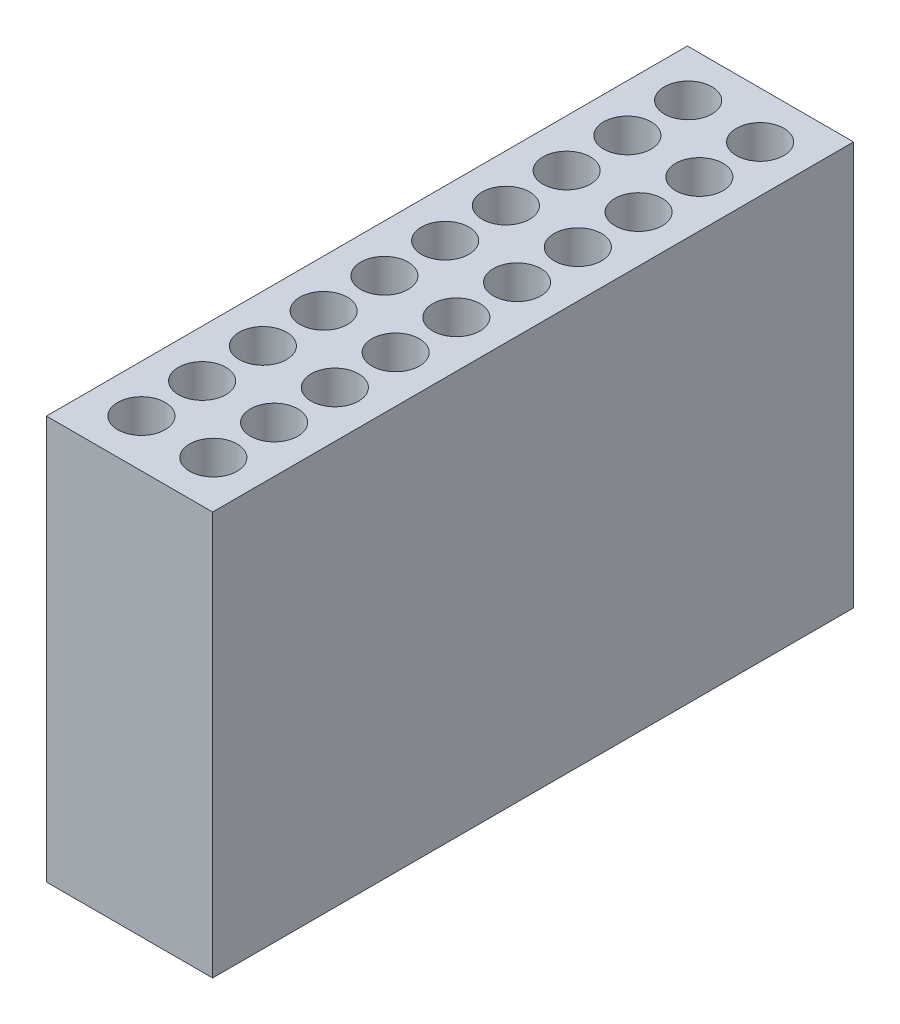
ISO-10303-21;
HEADER;
FILE_DESCRIPTION(('STEP AP214'),'2;1');
FILE_NAME('part.step','',(''),(''),'','','');
FILE_SCHEMA(('AUTOMOTIVE_DESIGN { 1 0 10303 214 1 1 1 1 }'));
ENDSEC;
DATA;
#1=APPLICATION_CONTEXT('core data for automotive mechanical design processes');
#2=APPLICATION_PROTOCOL_DEFINITION('international standard','automotive_design',2000,#1);
#3=PRODUCT_CONTEXT('',#1,'mechanical');
#4=PRODUCT('Part','Part','',(#3));
#5=PRODUCT_RELATED_PRODUCT_CATEGORY('part','',(#4));
#6=PRODUCT_DEFINITION_FORMATION('','',#4);
#7=PRODUCT_DEFINITION_CONTEXT('part definition',#1,'design');
#8=PRODUCT_DEFINITION('design','',#6,#7);
#9=PRODUCT_DEFINITION_SHAPE('','',#8);
#10=(LENGTH_UNIT() NAMED_UNIT(*) SI_UNIT(.MILLI.,.METRE.));
#11=(NAMED_UNIT(*) PLANE_ANGLE_UNIT() SI_UNIT($,.RADIAN.));
#12=(NAMED_UNIT(*) SI_UNIT($,.STERADIAN.) SOLID_ANGLE_UNIT());
#13=UNCERTAINTY_MEASURE_WITH_UNIT(LENGTH_MEASURE(1.E-05),#10,'distance_accuracy_value','');
#14=(GEOMETRIC_REPRESENTATION_CONTEXT(3) GLOBAL_UNCERTAINTY_ASSIGNED_CONTEXT((#13)) GLOBAL_UNIT_ASSIGNED_CONTEXT((#10,
#11,#12)) REPRESENTATION_CONTEXT('',''));
#15=CARTESIAN_POINT('',(0.,0.,0.));
#16=DIRECTION('',(0.,0.,1.));
#17=DIRECTION('',(1.,0.,0.));
#18=AXIS2_PLACEMENT_3D('',#15,#16,#17);
#19=CARTESIAN_POINT('',(0.389,0.,-2.929));
#20=DIRECTION('',(0.,1.,0.));
#21=DIRECTION('',(0.,0.,1.));
#22=AXIS2_PLACEMENT_3D('',#19,#20,#21);
#23=CYLINDRICAL_SURFACE('',#22,0.254);
#24=CARTESIAN_POINT('',(0.389,0.,-2.929));
#25=DIRECTION('',(0.,1.,0.));
#26=DIRECTION('',(0.,0.,1.));
#27=AXIS2_PLACEMENT_3D('',#24,#25,#26);
#28=CIRCLE('',#27,0.254);
#29=CARTESIAN_POINT('',(0.389,0.,-2.675));
#30=VERTEX_POINT('',#29);
#31=EDGE_CURVE('E42',#30,#30,#28,.T.);
#32=ORIENTED_EDGE('',*,*,#31,.F.);
#33=EDGE_LOOP('',(#32));
#34=FACE_BOUND('',#33,.T.);
#35=CARTESIAN_POINT('',(0.389,4.318,-2.929));
#36=DIRECTION('',(0.,1.,0.));
#37=DIRECTION('',(0.,0.,1.));
#38=AXIS2_PLACEMENT_3D('',#35,#36,#37);
#39=CIRCLE('',#38,0.254);
#40=CARTESIAN_POINT('',(0.389,4.318,-2.675));
#41=VERTEX_POINT('',#40);
#42=EDGE_CURVE('E11',#41,#41,#39,.T.);
#43=ORIENTED_EDGE('',*,*,#42,.T.);
#44=EDGE_LOOP('',(#43));
#45=FACE_BOUND('',#44,.T.);
#46=ADVANCED_FACE('F34',(#34,#45),#23,.F.);
#47=CARTESIAN_POINT('',(0.389,0.,-2.279));
#48=DIRECTION('',(0.,1.,0.));
#49=DIRECTION('',(0.,0.,1.));
#50=AXIS2_PLACEMENT_3D('',#47,#48,#49);
#51=CYLINDRICAL_SURFACE('',#50,0.254);
#52=CARTESIAN_POINT('',(0.389,0.,-2.279));
#53=DIRECTION('',(0.,1.,0.));
#54=DIRECTION('',(0.,0.,1.));
#55=AXIS2_PLACEMENT_3D('',#52,#53,#54);
#56=CIRCLE('',#55,0.254);
#57=CARTESIAN_POINT('',(0.389,0.,-2.025));
#58=VERTEX_POINT('',#57);
#59=EDGE_CURVE('E208',#58,#58,#56,.T.);
#60=ORIENTED_EDGE('',*,*,#59,.F.);
#61=EDGE_LOOP('',(#60));
#62=FACE_BOUND('',#61,.T.);
#63=CARTESIAN_POINT('',(0.389,4.318,-2.279));
#64=DIRECTION('',(0.,1.,0.));
#65=DIRECTION('',(0.,0.,1.));
#66=AXIS2_PLACEMENT_3D('',#63,#64,#65);
#67=CIRCLE('',#66,0.254);
#68=CARTESIAN_POINT('',(0.389,4.318,-2.025));
#69=VERTEX_POINT('',#68);
#70=EDGE_CURVE('E211',#69,#69,#67,.T.);
#71=ORIENTED_EDGE('',*,*,#70,.T.);
#72=EDGE_LOOP('',(#71));
#73=FACE_BOUND('',#72,.T.);
#74=ADVANCED_FACE('F220',(#62,#73),#51,.F.);
#75=CARTESIAN_POINT('',(0.389,0.,-1.629));
#76=DIRECTION('',(0.,1.,0.));
#77=DIRECTION('',(0.,0.,1.));
#78=AXIS2_PLACEMENT_3D('',#75,#76,#77);
#79=CYLINDRICAL_SURFACE('',#78,0.254);
#80=CARTESIAN_POINT('',(0.389,0.,-1.629));
#81=DIRECTION('',(0.,1.,0.));
#82=DIRECTION('',(0.,0.,1.));
#83=AXIS2_PLACEMENT_3D('',#80,#81,#82);
#84=CIRCLE('',#83,0.254);
#85=CARTESIAN_POINT('',(0.389,0.,-1.375));
#86=VERTEX_POINT('',#85);
#87=EDGE_CURVE('E202',#86,#86,#84,.T.);
#88=ORIENTED_EDGE('',*,*,#87,.F.);
#89=EDGE_LOOP('',(#88));
#90=FACE_BOUND('',#89,.T.);
#91=CARTESIAN_POINT('',(0.389,4.318,-1.629));
#92=DIRECTION('',(0.,1.,0.));
#93=DIRECTION('',(0.,0.,1.));
#94=AXIS2_PLACEMENT_3D('',#91,#92,#93);
#95=CIRCLE('',#94,0.254);
#96=CARTESIAN_POINT('',(0.389,4.318,-1.375));
#97=VERTEX_POINT('',#96);
#98=EDGE_CURVE('E205',#97,#97,#95,.T.);
#99=ORIENTED_EDGE('',*,*,#98,.T.);
#100=EDGE_LOOP('',(#99));
#101=FACE_BOUND('',#100,.T.);
#102=ADVANCED_FACE('F307',(#90,#101),#79,.F.);
#103=CARTESIAN_POINT('',(0.389,0.,-0.979));
#104=DIRECTION('',(0.,1.,0.));
#105=DIRECTION('',(0.,0.,1.));
#106=AXIS2_PLACEMENT_3D('',#103,#104,#105);
#107=CYLINDRICAL_SURFACE('',#106,0.254);
#108=CARTESIAN_POINT('',(0.389,0.,-0.979));
#109=DIRECTION('',(0.,1.,0.));
#110=DIRECTION('',(0.,0.,1.));
#111=AXIS2_PLACEMENT_3D('',#108,#109,#110);
#112=CIRCLE('',#111,0.254);
#113=CARTESIAN_POINT('',(0.389,0.,-0.725));
#114=VERTEX_POINT('',#113);
#115=EDGE_CURVE('E196',#114,#114,#112,.T.);
#116=ORIENTED_EDGE('',*,*,#115,.F.);
#117=EDGE_LOOP('',(#116));
#118=FACE_BOUND('',#117,.T.);
#119=CARTESIAN_POINT('',(0.389,4.318,-0.979));
#120=DIRECTION('',(0.,1.,0.));
#121=DIRECTION('',(0.,0.,1.));
#122=AXIS2_PLACEMENT_3D('',#119,#120,#121);
#123=CIRCLE('',#122,0.254);
#124=CARTESIAN_POINT('',(0.389,4.318,-0.725));
#125=VERTEX_POINT('',#124);
#126=EDGE_CURVE('E199',#125,#125,#123,.T.);
#127=ORIENTED_EDGE('',*,*,#126,.T.);
#128=EDGE_LOOP('',(#127));
#129=FACE_BOUND('',#128,.T.);
#130=ADVANCED_FACE('F303',(#118,#129),#107,.F.);
#131=CARTESIAN_POINT('',(0.389,0.,-0.329));
#132=DIRECTION('',(0.,1.,0.));
#133=DIRECTION('',(0.,0.,1.));
#134=AXIS2_PLACEMENT_3D('',#131,#132,#133);
#135=CYLINDRICAL_SURFACE('',#134,0.254);
#136=CARTESIAN_POINT('',(0.389,0.,-0.329));
#137=DIRECTION('',(0.,1.,0.));
#138=DIRECTION('',(0.,0.,1.));
#139=AXIS2_PLACEMENT_3D('',#136,#137,#138);
#140=CIRCLE('',#139,0.254);
#141=CARTESIAN_POINT('',(0.389,0.,-0.0749999999999999));
#142=VERTEX_POINT('',#141);
#143=EDGE_CURVE('E190',#142,#142,#140,.T.);
#144=ORIENTED_EDGE('',*,*,#143,.F.);
#145=EDGE_LOOP('',(#144));
#146=FACE_BOUND('',#145,.T.);
#147=CARTESIAN_POINT('',(0.389,4.318,-0.329));
#148=DIRECTION('',(0.,1.,0.));
#149=DIRECTION('',(0.,0.,1.));
#150=AXIS2_PLACEMENT_3D('',#147,#148,#149);
#151=CIRCLE('',#150,0.254);
#152=CARTESIAN_POINT('',(0.389,4.318,-0.0749999999999999));
#153=VERTEX_POINT('',#152);
#154=EDGE_CURVE('E193',#153,#153,#151,.T.);
#155=ORIENTED_EDGE('',*,*,#154,.T.);
#156=EDGE_LOOP('',(#155));
#157=FACE_BOUND('',#156,.T.);
#158=ADVANCED_FACE('F299',(#146,#157),#135,.F.);
#159=CARTESIAN_POINT('',(0.389,0.,0.321));
#160=DIRECTION('',(0.,1.,0.));
#161=DIRECTION('',(0.,0.,1.));
#162=AXIS2_PLACEMENT_3D('',#159,#160,#161);
#163=CYLINDRICAL_SURFACE('',#162,0.254);
#164=CARTESIAN_POINT('',(0.389,0.,0.321));
#165=DIRECTION('',(0.,1.,0.));
#166=DIRECTION('',(0.,0.,1.));
#167=AXIS2_PLACEMENT_3D('',#164,#165,#166);
#168=CIRCLE('',#167,0.254);
#169=CARTESIAN_POINT('',(0.389,0.,0.575));
#170=VERTEX_POINT('',#169);
#171=EDGE_CURVE('E184',#170,#170,#168,.T.);
#172=ORIENTED_EDGE('',*,*,#171,.F.);
#173=EDGE_LOOP('',(#172));
#174=FACE_BOUND('',#173,.T.);
#175=CARTESIAN_POINT('',(0.389,4.318,0.321));
#176=DIRECTION('',(0.,1.,0.));
#177=DIRECTION('',(0.,0.,1.));
#178=AXIS2_PLACEMENT_3D('',#175,#176,#177);
#179=CIRCLE('',#178,0.254);
#180=CARTESIAN_POINT('',(0.389,4.318,0.575));
#181=VERTEX_POINT('',#180);
#182=EDGE_CURVE('E187',#181,#181,#179,.T.);
#183=ORIENTED_EDGE('',*,*,#182,.T.);
#184=EDGE_LOOP('',(#183));
#185=FACE_BOUND('',#184,.T.);
#186=ADVANCED_FACE('F295',(#174,#185),#163,.F.);
#187=CARTESIAN_POINT('',(0.389,0.,0.971));
#188=DIRECTION('',(0.,1.,0.));
#189=DIRECTION('',(0.,0.,1.));
#190=AXIS2_PLACEMENT_3D('',#187,#188,#189);
#191=CYLINDRICAL_SURFACE('',#190,0.254);
#192=CARTESIAN_POINT('',(0.389,0.,0.971));
#193=DIRECTION('',(0.,1.,0.));
#194=DIRECTION('',(0.,0.,1.));
#195=AXIS2_PLACEMENT_3D('',#192,#193,#194);
#196=CIRCLE('',#195,0.254);
#197=CARTESIAN_POINT('',(0.389,0.,1.225));
#198=VERTEX_POINT('',#197);
#199=EDGE_CURVE('E178',#198,#198,#196,.T.);
#200=ORIENTED_EDGE('',*,*,#199,.F.);
#201=EDGE_LOOP('',(#200));
#202=FACE_BOUND('',#201,.T.);
#203=CARTESIAN_POINT('',(0.389,4.318,0.971));
#204=DIRECTION('',(0.,1.,0.));
#205=DIRECTION('',(0.,0.,1.));
#206=AXIS2_PLACEMENT_3D('',#203,#204,#205);
#207=CIRCLE('',#206,0.254);
#208=CARTESIAN_POINT('',(0.389,4.318,1.225));
#209=VERTEX_POINT('',#208);
#210=EDGE_CURVE('E181',#209,#209,#207,.T.);
#211=ORIENTED_EDGE('',*,*,#210,.T.);
#212=EDGE_LOOP('',(#211));
#213=FACE_BOUND('',#212,.T.);
#214=ADVANCED_FACE('F291',(#202,#213),#191,.F.);
#215=CARTESIAN_POINT('',(0.389,0.,1.621));
#216=DIRECTION('',(0.,1.,0.));
#217=DIRECTION('',(0.,0.,1.));
#218=AXIS2_PLACEMENT_3D('',#215,#216,#217);
#219=CYLINDRICAL_SURFACE('',#218,0.254);
#220=CARTESIAN_POINT('',(0.389,0.,1.621));
#221=DIRECTION('',(0.,1.,0.));
#222=DIRECTION('',(0.,0.,1.));
#223=AXIS2_PLACEMENT_3D('',#220,#221,#222);
#224=CIRCLE('',#223,0.254);
#225=CARTESIAN_POINT('',(0.389,0.,1.875));
#226=VERTEX_POINT('',#225);
#227=EDGE_CURVE('E172',#226,#226,#224,.T.);
#228=ORIENTED_EDGE('',*,*,#227,.F.);
#229=EDGE_LOOP('',(#228));
#230=FACE_BOUND('',#229,.T.);
#231=CARTESIAN_POINT('',(0.389,4.318,1.621));
#232=DIRECTION('',(0.,1.,0.));
#233=DIRECTION('',(0.,0.,1.));
#234=AXIS2_PLACEMENT_3D('',#231,#232,#233);
#235=CIRCLE('',#234,0.254);
#236=CARTESIAN_POINT('',(0.389,4.318,1.875));
#237=VERTEX_POINT('',#236);
#238=EDGE_CURVE('E175',#237,#237,#235,.T.);
#239=ORIENTED_EDGE('',*,*,#238,.T.);
#240=EDGE_LOOP('',(#239));
#241=FACE_BOUND('',#240,.T.);
#242=ADVANCED_FACE('F287',(#230,#241),#219,.F.);
#243=CARTESIAN_POINT('',(0.389,0.,2.271));
#244=DIRECTION('',(0.,1.,0.));
#245=DIRECTION('',(0.,0.,1.));
#246=AXIS2_PLACEMENT_3D('',#243,#244,#245);
#247=CYLINDRICAL_SURFACE('',#246,0.254);
#248=CARTESIAN_POINT('',(0.389,0.,2.271));
#249=DIRECTION('',(0.,1.,0.));
#250=DIRECTION('',(0.,0.,1.));
#251=AXIS2_PLACEMENT_3D('',#248,#249,#250);
#252=CIRCLE('',#251,0.254);
#253=CARTESIAN_POINT('',(0.389,0.,2.525));
#254=VERTEX_POINT('',#253);
#255=EDGE_CURVE('E166',#254,#254,#252,.T.);
#256=ORIENTED_EDGE('',*,*,#255,.F.);
#257=EDGE_LOOP('',(#256));
#258=FACE_BOUND('',#257,.T.);
#259=CARTESIAN_POINT('',(0.389,4.318,2.271));
#260=DIRECTION('',(0.,1.,0.));
#261=DIRECTION('',(0.,0.,1.));
#262=AXIS2_PLACEMENT_3D('',#259,#260,#261);
#263=CIRCLE('',#262,0.254);
#264=CARTESIAN_POINT('',(0.389,4.318,2.525));
#265=VERTEX_POINT('',#264);
#266=EDGE_CURVE('E169',#265,#265,#263,.T.);
#267=ORIENTED_EDGE('',*,*,#266,.T.);
#268=EDGE_LOOP('',(#267));
#269=FACE_BOUND('',#268,.T.);
#270=ADVANCED_FACE('F283',(#258,#269),#247,.F.);
#271=CARTESIAN_POINT('',(0.389,0.,2.921));
#272=DIRECTION('',(0.,1.,0.));
#273=DIRECTION('',(0.,0.,1.));
#274=AXIS2_PLACEMENT_3D('',#271,#272,#273);
#275=CYLINDRICAL_SURFACE('',#274,0.254);
#276=CARTESIAN_POINT('',(0.389,0.,2.921));
#277=DIRECTION('',(0.,1.,0.));
#278=DIRECTION('',(0.,0.,1.));
#279=AXIS2_PLACEMENT_3D('',#276,#277,#278);
#280=CIRCLE('',#279,0.254);
#281=CARTESIAN_POINT('',(0.389,0.,3.175));
#282=VERTEX_POINT('',#281);
#283=EDGE_CURVE('E160',#282,#282,#280,.T.);
#284=ORIENTED_EDGE('',*,*,#283,.F.);
#285=EDGE_LOOP('',(#284));
#286=FACE_BOUND('',#285,.T.);
#287=CARTESIAN_POINT('',(0.389,4.318,2.921));
#288=DIRECTION('',(0.,1.,0.));
#289=DIRECTION('',(0.,0.,1.));
#290=AXIS2_PLACEMENT_3D('',#287,#288,#289);
#291=CIRCLE('',#290,0.254);
#292=CARTESIAN_POINT('',(0.389,4.318,3.175));
#293=VERTEX_POINT('',#292);
#294=EDGE_CURVE('E163',#293,#293,#291,.T.);
#295=ORIENTED_EDGE('',*,*,#294,.T.);
#296=EDGE_LOOP('',(#295));
#297=FACE_BOUND('',#296,.T.);
#298=ADVANCED_FACE('F279',(#286,#297),#275,.F.);
#299=CARTESIAN_POINT('',(-0.381,0.,-2.929));
#300=DIRECTION('',(0.,1.,0.));
#301=DIRECTION('',(0.,0.,1.));
#302=AXIS2_PLACEMENT_3D('',#299,#300,#301);
#303=CYLINDRICAL_SURFACE('',#302,0.254);
#304=CARTESIAN_POINT('',(-0.381,0.,-2.929));
#305=DIRECTION('',(0.,1.,0.));
#306=DIRECTION('',(0.,0.,1.));
#307=AXIS2_PLACEMENT_3D('',#304,#305,#306);
#308=CIRCLE('',#307,0.254);
#309=CARTESIAN_POINT('',(-0.381,0.,-2.675));
#310=VERTEX_POINT('',#309);
#311=EDGE_CURVE('E154',#310,#310,#308,.T.);
#312=ORIENTED_EDGE('',*,*,#311,.F.);
#313=EDGE_LOOP('',(#312));
#314=FACE_BOUND('',#313,.T.);
#315=CARTESIAN_POINT('',(-0.381,4.318,-2.929));
#316=DIRECTION('',(0.,1.,0.));
#317=DIRECTION('',(0.,0.,1.));
#318=AXIS2_PLACEMENT_3D('',#315,#316,#317);
#319=CIRCLE('',#318,0.254);
#320=CARTESIAN_POINT('',(-0.381,4.318,-2.675));
#321=VERTEX_POINT('',#320);
#322=EDGE_CURVE('E157',#321,#321,#319,.T.);
#323=ORIENTED_EDGE('',*,*,#322,.T.);
#324=EDGE_LOOP('',(#323));
#325=FACE_BOUND('',#324,.T.);
#326=ADVANCED_FACE('F275',(#314,#325),#303,.F.);
#327=CARTESIAN_POINT('',(-0.381,0.,-2.279));
#328=DIRECTION('',(0.,1.,0.));
#329=DIRECTION('',(0.,0.,1.));
#330=AXIS2_PLACEMENT_3D('',#327,#328,#329);
#331=CYLINDRICAL_SURFACE('',#330,0.254);
#332=CARTESIAN_POINT('',(-0.381,0.,-2.279));
#333=DIRECTION('',(0.,1.,0.));
#334=DIRECTION('',(0.,0.,1.));
#335=AXIS2_PLACEMENT_3D('',#332,#333,#334);
#336=CIRCLE('',#335,0.254);
#337=CARTESIAN_POINT('',(-0.381,0.,-2.025));
#338=VERTEX_POINT('',#337);
#339=EDGE_CURVE('E148',#338,#338,#336,.T.);
#340=ORIENTED_EDGE('',*,*,#339,.F.);
#341=EDGE_LOOP('',(#340));
#342=FACE_BOUND('',#341,.T.);
#343=CARTESIAN_POINT('',(-0.381,4.318,-2.279));
#344=DIRECTION('',(0.,1.,0.));
#345=DIRECTION('',(0.,0.,1.));
#346=AXIS2_PLACEMENT_3D('',#343,#344,#345);
#347=CIRCLE('',#346,0.254);
#348=CARTESIAN_POINT('',(-0.381,4.318,-2.025));
#349=VERTEX_POINT('',#348);
#350=EDGE_CURVE('E151',#349,#349,#347,.T.);
#351=ORIENTED_EDGE('',*,*,#350,.T.);
#352=EDGE_LOOP('',(#351));
#353=FACE_BOUND('',#352,.T.);
#354=ADVANCED_FACE('F271',(#342,#353),#331,.F.);
#355=CARTESIAN_POINT('',(-0.381,0.,-1.629));
#356=DIRECTION('',(0.,1.,0.));
#357=DIRECTION('',(0.,0.,1.));
#358=AXIS2_PLACEMENT_3D('',#355,#356,#357);
#359=CYLINDRICAL_SURFACE('',#358,0.254);
#360=CARTESIAN_POINT('',(-0.381,0.,-1.629));
#361=DIRECTION('',(0.,1.,0.));
#362=DIRECTION('',(0.,0.,1.));
#363=AXIS2_PLACEMENT_3D('',#360,#361,#362);
#364=CIRCLE('',#363,0.254);
#365=CARTESIAN_POINT('',(-0.381,0.,-1.375));
#366=VERTEX_POINT('',#365);
#367=EDGE_CURVE('E142',#366,#366,#364,.T.);
#368=ORIENTED_EDGE('',*,*,#367,.F.);
#369=EDGE_LOOP('',(#368));
#370=FACE_BOUND('',#369,.T.);
#371=CARTESIAN_POINT('',(-0.381,4.318,-1.629));
#372=DIRECTION('',(0.,1.,0.));
#373=DIRECTION('',(0.,0.,1.));
#374=AXIS2_PLACEMENT_3D('',#371,#372,#373);
#375=CIRCLE('',#374,0.254);
#376=CARTESIAN_POINT('',(-0.381,4.318,-1.375));
#377=VERTEX_POINT('',#376);
#378=EDGE_CURVE('E145',#377,#377,#375,.T.);
#379=ORIENTED_EDGE('',*,*,#378,.T.);
#380=EDGE_LOOP('',(#379));
#381=FACE_BOUND('',#380,.T.);
#382=ADVANCED_FACE('F267',(#370,#381),#359,.F.);
#383=CARTESIAN_POINT('',(-0.381,0.,-0.979));
#384=DIRECTION('',(0.,1.,0.));
#385=DIRECTION('',(0.,0.,1.));
#386=AXIS2_PLACEMENT_3D('',#383,#384,#385);
#387=CYLINDRICAL_SURFACE('',#386,0.254);
#388=CARTESIAN_POINT('',(-0.381,0.,-0.979));
#389=DIRECTION('',(0.,1.,0.));
#390=DIRECTION('',(0.,0.,1.));
#391=AXIS2_PLACEMENT_3D('',#388,#389,#390);
#392=CIRCLE('',#391,0.254);
#393=CARTESIAN_POINT('',(-0.381,0.,-0.725));
#394=VERTEX_POINT('',#393);
#395=EDGE_CURVE('E136',#394,#394,#392,.T.);
#396=ORIENTED_EDGE('',*,*,#395,.F.);
#397=EDGE_LOOP('',(#396));
#398=FACE_BOUND('',#397,.T.);
#399=CARTESIAN_POINT('',(-0.381,4.318,-0.979));
#400=DIRECTION('',(0.,1.,0.));
#401=DIRECTION('',(0.,0.,1.));
#402=AXIS2_PLACEMENT_3D('',#399,#400,#401);
#403=CIRCLE('',#402,0.254);
#404=CARTESIAN_POINT('',(-0.381,4.318,-0.725));
#405=VERTEX_POINT('',#404);
#406=EDGE_CURVE('E139',#405,#405,#403,.T.);
#407=ORIENTED_EDGE('',*,*,#406,.T.);
#408=EDGE_LOOP('',(#407));
#409=FACE_BOUND('',#408,.T.);
#410=ADVANCED_FACE('F263',(#398,#409),#387,.F.);
#411=CARTESIAN_POINT('',(-0.381,0.,-0.329));
#412=DIRECTION('',(0.,1.,0.));
#413=DIRECTION('',(0.,0.,1.));
#414=AXIS2_PLACEMENT_3D('',#411,#412,#413);
#415=CYLINDRICAL_SURFACE('',#414,0.254);
#416=CARTESIAN_POINT('',(-0.381,0.,-0.329));
#417=DIRECTION('',(0.,1.,0.));
#418=DIRECTION('',(0.,0.,1.));
#419=AXIS2_PLACEMENT_3D('',#416,#417,#418);
#420=CIRCLE('',#419,0.254);
#421=CARTESIAN_POINT('',(-0.381,0.,-0.0749999999999999));
#422=VERTEX_POINT('',#421);
#423=EDGE_CURVE('E130',#422,#422,#420,.T.);
#424=ORIENTED_EDGE('',*,*,#423,.F.);
#425=EDGE_LOOP('',(#424));
#426=FACE_BOUND('',#425,.T.);
#427=CARTESIAN_POINT('',(-0.381,4.318,-0.329));
#428=DIRECTION('',(0.,1.,0.));
#429=DIRECTION('',(0.,0.,1.));
#430=AXIS2_PLACEMENT_3D('',#427,#428,#429);
#431=CIRCLE('',#430,0.254);
#432=CARTESIAN_POINT('',(-0.381,4.318,-0.0749999999999999));
#433=VERTEX_POINT('',#432);
#434=EDGE_CURVE('E133',#433,#433,#431,.T.);
#435=ORIENTED_EDGE('',*,*,#434,.T.);
#436=EDGE_LOOP('',(#435));
#437=FACE_BOUND('',#436,.T.);
#438=ADVANCED_FACE('F259',(#426,#437),#415,.F.);
#439=CARTESIAN_POINT('',(-0.381,0.,0.321));
#440=DIRECTION('',(0.,1.,0.));
#441=DIRECTION('',(0.,0.,1.));
#442=AXIS2_PLACEMENT_3D('',#439,#440,#441);
#443=CYLINDRICAL_SURFACE('',#442,0.254);
#444=CARTESIAN_POINT('',(-0.381,0.,0.321));
#445=DIRECTION('',(0.,1.,0.));
#446=DIRECTION('',(0.,0.,1.));
#447=AXIS2_PLACEMENT_3D('',#444,#445,#446);
#448=CIRCLE('',#447,0.254);
#449=CARTESIAN_POINT('',(-0.381,0.,0.575));
#450=VERTEX_POINT('',#449);
#451=EDGE_CURVE('E124',#450,#450,#448,.T.);
#452=ORIENTED_EDGE('',*,*,#451,.F.);
#453=EDGE_LOOP('',(#452));
#454=FACE_BOUND('',#453,.T.);
#455=CARTESIAN_POINT('',(-0.381,4.318,0.321));
#456=DIRECTION('',(0.,1.,0.));
#457=DIRECTION('',(0.,0.,1.));
#458=AXIS2_PLACEMENT_3D('',#455,#456,#457);
#459=CIRCLE('',#458,0.254);
#460=CARTESIAN_POINT('',(-0.381,4.318,0.575));
#461=VERTEX_POINT('',#460);
#462=EDGE_CURVE('E127',#461,#461,#459,.T.);
#463=ORIENTED_EDGE('',*,*,#462,.T.);
#464=EDGE_LOOP('',(#463));
#465=FACE_BOUND('',#464,.T.);
#466=ADVANCED_FACE('F255',(#454,#465),#443,.F.);
#467=CARTESIAN_POINT('',(-0.381,0.,0.971));
#468=DIRECTION('',(0.,1.,0.));
#469=DIRECTION('',(0.,0.,1.));
#470=AXIS2_PLACEMENT_3D('',#467,#468,#469);
#471=CYLINDRICAL_SURFACE('',#470,0.254);
#472=CARTESIAN_POINT('',(-0.381,0.,0.971));
#473=DIRECTION('',(0.,1.,0.));
#474=DIRECTION('',(0.,0.,1.));
#475=AXIS2_PLACEMENT_3D('',#472,#473,#474);
#476=CIRCLE('',#475,0.254);
#477=CARTESIAN_POINT('',(-0.381,0.,1.225));
#478=VERTEX_POINT('',#477);
#479=EDGE_CURVE('E118',#478,#478,#476,.T.);
#480=ORIENTED_EDGE('',*,*,#479,.F.);
#481=EDGE_LOOP('',(#480));
#482=FACE_BOUND('',#481,.T.);
#483=CARTESIAN_POINT('',(-0.381,4.318,0.971));
#484=DIRECTION('',(0.,1.,0.));
#485=DIRECTION('',(0.,0.,1.));
#486=AXIS2_PLACEMENT_3D('',#483,#484,#485);
#487=CIRCLE('',#486,0.254);
#488=CARTESIAN_POINT('',(-0.381,4.318,1.225));
#489=VERTEX_POINT('',#488);
#490=EDGE_CURVE('E121',#489,#489,#487,.T.);
#491=ORIENTED_EDGE('',*,*,#490,.T.);
#492=EDGE_LOOP('',(#491));
#493=FACE_BOUND('',#492,.T.);
#494=ADVANCED_FACE('F251',(#482,#493),#471,.F.);
#495=CARTESIAN_POINT('',(-0.381,0.,1.621));
#496=DIRECTION('',(0.,1.,0.));
#497=DIRECTION('',(0.,0.,1.));
#498=AXIS2_PLACEMENT_3D('',#495,#496,#497);
#499=CYLINDRICAL_SURFACE('',#498,0.254);
#500=CARTESIAN_POINT('',(-0.381,0.,1.621));
#501=DIRECTION('',(0.,1.,0.));
#502=DIRECTION('',(0.,0.,1.));
#503=AXIS2_PLACEMENT_3D('',#500,#501,#502);
#504=CIRCLE('',#503,0.254);
#505=CARTESIAN_POINT('',(-0.381,0.,1.875));
#506=VERTEX_POINT('',#505);
#507=EDGE_CURVE('E112',#506,#506,#504,.T.);
#508=ORIENTED_EDGE('',*,*,#507,.F.);
#509=EDGE_LOOP('',(#508));
#510=FACE_BOUND('',#509,.T.);
#511=CARTESIAN_POINT('',(-0.381,4.318,1.621));
#512=DIRECTION('',(0.,1.,0.));
#513=DIRECTION('',(0.,0.,1.));
#514=AXIS2_PLACEMENT_3D('',#511,#512,#513);
#515=CIRCLE('',#514,0.254);
#516=CARTESIAN_POINT('',(-0.381,4.318,1.875));
#517=VERTEX_POINT('',#516);
#518=EDGE_CURVE('E115',#517,#517,#515,.T.);
#519=ORIENTED_EDGE('',*,*,#518,.T.);
#520=EDGE_LOOP('',(#519));
#521=FACE_BOUND('',#520,.T.);
#522=ADVANCED_FACE('F247',(#510,#521),#499,.F.);
#523=CARTESIAN_POINT('',(0.889,4.318,3.429));
#524=DIRECTION('',(-1.,0.,0.));
#525=DIRECTION('',(0.,0.,1.));
#526=AXIS2_PLACEMENT_3D('',#523,#524,#525);
#527=PLANE('',#526);
#528=DIRECTION('',(0.,0.,-1.));
#529=VECTOR('',#528,1.);
#530=CARTESIAN_POINT('',(0.889,0.,3.429));
#531=LINE('',#530,#529);
#532=CARTESIAN_POINT('',(0.889,0.,3.429));
#533=VERTEX_POINT('',#532);
#534=CARTESIAN_POINT('',(0.889,0.,-3.429));
#535=VERTEX_POINT('',#534);
#536=EDGE_CURVE('E102',#533,#535,#531,.T.);
#537=ORIENTED_EDGE('',*,*,#536,.T.);
#538=DIRECTION('',(0.,-1.,0.));
#539=VECTOR('',#538,1.);
#540=CARTESIAN_POINT('',(0.889,4.318,-3.429));
#541=LINE('',#540,#539);
#542=CARTESIAN_POINT('',(0.889,4.318,-3.429));
#543=VERTEX_POINT('',#542);
#544=EDGE_CURVE('E93',#543,#535,#541,.T.);
#545=ORIENTED_EDGE('',*,*,#544,.F.);
#546=DIRECTION('',(0.,0.,-1.));
#547=VECTOR('',#546,1.);
#548=CARTESIAN_POINT('',(0.889,4.318,3.429));
#549=LINE('',#548,#547);
#550=CARTESIAN_POINT('',(0.889,4.318,3.429));
#551=VERTEX_POINT('',#550);
#552=EDGE_CURVE('E87',#551,#543,#549,.T.);
#553=ORIENTED_EDGE('',*,*,#552,.F.);
#554=DIRECTION('',(0.,-1.,0.));
#555=VECTOR('',#554,1.);
#556=CARTESIAN_POINT('',(0.889,4.318,3.429));
#557=LINE('',#556,#555);
#558=EDGE_CURVE('E98',#551,#533,#557,.T.);
#559=ORIENTED_EDGE('',*,*,#558,.T.);
#560=EDGE_LOOP('',(#537,#545,#553,#559));
#561=FACE_BOUND('',#560,.T.);
#562=ADVANCED_FACE('F244',(#561),#527,.F.);
#563=CARTESIAN_POINT('',(-0.889,4.318,-3.429));
#564=DIRECTION('',(0.,0.,1.));
#565=DIRECTION('',(1.,0.,0.));
#566=AXIS2_PLACEMENT_3D('',#563,#564,#565);
#567=PLANE('',#566);
#568=DIRECTION('',(-1.,0.,0.));
#569=VECTOR('',#568,1.);
#570=CARTESIAN_POINT('',(-0.889,0.,-3.429));
#571=LINE('',#570,#569);
#572=CARTESIAN_POINT('',(-0.889,0.,-3.429));
#573=VERTEX_POINT('',#572);
#574=EDGE_CURVE('E92',#535,#573,#571,.T.);
#575=ORIENTED_EDGE('',*,*,#574,.T.);
#576=DIRECTION('',(0.,-1.,0.));
#577=VECTOR('',#576,1.);
#578=CARTESIAN_POINT('',(-0.889,4.318,-3.429));
#579=LINE('',#578,#577);
#580=CARTESIAN_POINT('',(-0.889,4.318,-3.429));
#581=VERTEX_POINT('',#580);
#582=EDGE_CURVE('E90',#581,#573,#579,.T.);
#583=ORIENTED_EDGE('',*,*,#582,.F.);
#584=DIRECTION('',(-1.,0.,0.));
#585=VECTOR('',#584,1.);
#586=CARTESIAN_POINT('',(-0.889,4.318,-3.429));
#587=LINE('',#586,#585);
#588=EDGE_CURVE('E81',#543,#581,#587,.T.);
#589=ORIENTED_EDGE('',*,*,#588,.F.);
#590=ORIENTED_EDGE('',*,*,#544,.T.);
#591=EDGE_LOOP('',(#575,#583,#589,#590));
#592=FACE_BOUND('',#591,.T.);
#593=ADVANCED_FACE('F91',(#592),#567,.F.);
#594=CARTESIAN_POINT('',(-0.889,4.318,3.429));
#595=DIRECTION('',(1.,0.,0.));
#596=DIRECTION('',(0.,0.,-1.));
#597=AXIS2_PLACEMENT_3D('',#594,#595,#596);
#598=PLANE('',#597);
#599=DIRECTION('',(0.,0.,1.));
#600=VECTOR('',#599,1.);
#601=CARTESIAN_POINT('',(-0.889,0.,3.429));
#602=LINE('',#601,#600);
#603=CARTESIAN_POINT('',(-0.889,0.,3.429));
#604=VERTEX_POINT('',#603);
#605=EDGE_CURVE('E67',#573,#604,#602,.T.);
#606=ORIENTED_EDGE('',*,*,#605,.T.);
#607=DIRECTION('',(0.,-1.,0.));
#608=VECTOR('',#607,1.);
#609=CARTESIAN_POINT('',(-0.889,4.318,3.429));
#610=LINE('',#609,#608);
#611=CARTESIAN_POINT('',(-0.889,4.318,3.429));
#612=VERTEX_POINT('',#611);
#613=EDGE_CURVE('E94',#612,#604,#610,.T.);
#614=ORIENTED_EDGE('',*,*,#613,.F.);
#615=DIRECTION('',(0.,0.,1.));
#616=VECTOR('',#615,1.);
#617=CARTESIAN_POINT('',(-0.889,4.318,3.429));
#618=LINE('',#617,#616);
#619=EDGE_CURVE('E85',#581,#612,#618,.T.);
#620=ORIENTED_EDGE('',*,*,#619,.F.);
#621=ORIENTED_EDGE('',*,*,#582,.T.);
#622=EDGE_LOOP('',(#606,#614,#620,#621));
#623=FACE_BOUND('',#622,.T.);
#624=ADVANCED_FACE('F96',(#623),#598,.F.);
#625=CARTESIAN_POINT('',(-0.889,4.318,3.429));
#626=DIRECTION('',(0.,0.,-1.));
#627=DIRECTION('',(-1.,0.,0.));
#628=AXIS2_PLACEMENT_3D('',#625,#626,#627);
#629=PLANE('',#628);
#630=DIRECTION('',(1.,0.,0.));
#631=VECTOR('',#630,1.);
#632=CARTESIAN_POINT('',(-0.889,0.,3.429));
#633=LINE('',#632,#631);
#634=EDGE_CURVE('E73',#604,#533,#633,.T.);
#635=ORIENTED_EDGE('',*,*,#634,.T.);
#636=ORIENTED_EDGE('',*,*,#558,.F.);
#637=DIRECTION('',(1.,0.,0.));
#638=VECTOR('',#637,1.);
#639=CARTESIAN_POINT('',(-0.889,4.318,3.429));
#640=LINE('',#639,#638);
#641=EDGE_CURVE('E50',#612,#551,#640,.T.);
#642=ORIENTED_EDGE('',*,*,#641,.F.);
#643=ORIENTED_EDGE('',*,*,#613,.T.);
#644=EDGE_LOOP('',(#635,#636,#642,#643));
#645=FACE_BOUND('',#644,.T.);
#646=ADVANCED_FACE('F224',(#645),#629,.F.);
#647=CARTESIAN_POINT('',(0.,4.318,0.));
#648=DIRECTION('',(0.,-1.,0.));
#649=DIRECTION('',(0.,0.,-1.));
#650=AXIS2_PLACEMENT_3D('',#647,#648,#649);
#651=PLANE('',#650);
#652=CARTESIAN_POINT('',(-0.381,4.318,2.271));
#653=DIRECTION('',(0.,1.,0.));
#654=DIRECTION('',(0.,0.,1.));
#655=AXIS2_PLACEMENT_3D('',#652,#653,#654);
#656=CIRCLE('',#655,0.254);
#657=CARTESIAN_POINT('',(-0.381,4.318,2.525));
#658=VERTEX_POINT('',#657);
#659=EDGE_CURVE('E476',#658,#658,#656,.T.);
#660=ORIENTED_EDGE('',*,*,#659,.F.);
#661=EDGE_LOOP('',(#660));
#662=FACE_BOUND('',#661,.T.);
#663=CARTESIAN_POINT('',(-0.381,4.318,2.921));
#664=DIRECTION('',(0.,1.,0.));
#665=DIRECTION('',(0.,0.,1.));
#666=AXIS2_PLACEMENT_3D('',#663,#664,#665);
#667=CIRCLE('',#666,0.254);
#668=CARTESIAN_POINT('',(-0.381,4.318,3.175));
#669=VERTEX_POINT('',#668);
#670=EDGE_CURVE('E477',#669,#669,#667,.T.);
#671=ORIENTED_EDGE('',*,*,#670,.F.);
#672=EDGE_LOOP('',(#671));
#673=FACE_BOUND('',#672,.T.);
#674=ORIENTED_EDGE('',*,*,#552,.T.);
#675=ORIENTED_EDGE('',*,*,#588,.T.);
#676=ORIENTED_EDGE('',*,*,#619,.T.);
#677=ORIENTED_EDGE('',*,*,#641,.T.);
#678=EDGE_LOOP('',(#674,#675,#676,#677));
#679=FACE_BOUND('',#678,.T.);
#680=ORIENTED_EDGE('',*,*,#518,.F.);
#681=EDGE_LOOP('',(#680));
#682=FACE_BOUND('',#681,.T.);
#683=ORIENTED_EDGE('',*,*,#490,.F.);
#684=EDGE_LOOP('',(#683));
#685=FACE_BOUND('',#684,.T.);
#686=ORIENTED_EDGE('',*,*,#462,.F.);
#687=EDGE_LOOP('',(#686));
#688=FACE_BOUND('',#687,.T.);
#689=ORIENTED_EDGE('',*,*,#434,.F.);
#690=EDGE_LOOP('',(#689));
#691=FACE_BOUND('',#690,.T.);
#692=ORIENTED_EDGE('',*,*,#406,.F.);
#693=EDGE_LOOP('',(#692));
#694=FACE_BOUND('',#693,.T.);
#695=ORIENTED_EDGE('',*,*,#378,.F.);
#696=EDGE_LOOP('',(#695));
#697=FACE_BOUND('',#696,.T.);
#698=ORIENTED_EDGE('',*,*,#350,.F.);
#699=EDGE_LOOP('',(#698));
#700=FACE_BOUND('',#699,.T.);
#701=ORIENTED_EDGE('',*,*,#322,.F.);
#702=EDGE_LOOP('',(#701));
#703=FACE_BOUND('',#702,.T.);
#704=ORIENTED_EDGE('',*,*,#294,.F.);
#705=EDGE_LOOP('',(#704));
#706=FACE_BOUND('',#705,.T.);
#707=ORIENTED_EDGE('',*,*,#266,.F.);
#708=EDGE_LOOP('',(#707));
#709=FACE_BOUND('',#708,.T.);
#710=ORIENTED_EDGE('',*,*,#238,.F.);
#711=EDGE_LOOP('',(#710));
#712=FACE_BOUND('',#711,.T.);
#713=ORIENTED_EDGE('',*,*,#210,.F.);
#714=EDGE_LOOP('',(#713));
#715=FACE_BOUND('',#714,.T.);
#716=ORIENTED_EDGE('',*,*,#182,.F.);
#717=EDGE_LOOP('',(#716));
#718=FACE_BOUND('',#717,.T.);
#719=ORIENTED_EDGE('',*,*,#154,.F.);
#720=EDGE_LOOP('',(#719));
#721=FACE_BOUND('',#720,.T.);
#722=ORIENTED_EDGE('',*,*,#126,.F.);
#723=EDGE_LOOP('',(#722));
#724=FACE_BOUND('',#723,.T.);
#725=ORIENTED_EDGE('',*,*,#98,.F.);
#726=EDGE_LOOP('',(#725));
#727=FACE_BOUND('',#726,.T.);
#728=ORIENTED_EDGE('',*,*,#70,.F.);
#729=EDGE_LOOP('',(#728));
#730=FACE_BOUND('',#729,.T.);
#731=ORIENTED_EDGE('',*,*,#42,.F.);
#732=EDGE_LOOP('',(#731));
#733=FACE_BOUND('',#732,.T.);
#734=ADVANCED_FACE('F82',(#662,#673,#679,#682,#685,#688,#691,#694,#697,#700,#703,#706,#709,#712,
#715,#718,#721,#724,#727,#730,#733),#651,.F.);
#735=CARTESIAN_POINT('',(0.,0.,0.));
#736=DIRECTION('',(0.,-1.,0.));
#737=DIRECTION('',(0.,0.,-1.));
#738=AXIS2_PLACEMENT_3D('',#735,#736,#737);
#739=PLANE('',#738);
#740=CARTESIAN_POINT('',(-0.381,0.,2.271));
#741=DIRECTION('',(0.,1.,0.));
#742=DIRECTION('',(0.,0.,1.));
#743=AXIS2_PLACEMENT_3D('',#740,#741,#742);
#744=CIRCLE('',#743,0.254);
#745=CARTESIAN_POINT('',(-0.381,0.,2.525));
#746=VERTEX_POINT('',#745);
#747=EDGE_CURVE('E474',#746,#746,#744,.T.);
#748=ORIENTED_EDGE('',*,*,#747,.T.);
#749=EDGE_LOOP('',(#748));
#750=FACE_BOUND('',#749,.T.);
#751=CARTESIAN_POINT('',(-0.381,0.,2.921));
#752=DIRECTION('',(0.,1.,0.));
#753=DIRECTION('',(0.,0.,1.));
#754=AXIS2_PLACEMENT_3D('',#751,#752,#753);
#755=CIRCLE('',#754,0.254);
#756=CARTESIAN_POINT('',(-0.381,0.,3.175));
#757=VERTEX_POINT('',#756);
#758=EDGE_CURVE('E105',#757,#757,#755,.T.);
#759=ORIENTED_EDGE('',*,*,#758,.T.);
#760=EDGE_LOOP('',(#759));
#761=FACE_BOUND('',#760,.T.);
#762=ORIENTED_EDGE('',*,*,#536,.F.);
#763=ORIENTED_EDGE('',*,*,#634,.F.);
#764=ORIENTED_EDGE('',*,*,#605,.F.);
#765=ORIENTED_EDGE('',*,*,#574,.F.);
#766=EDGE_LOOP('',(#762,#763,#764,#765));
#767=FACE_BOUND('',#766,.T.);
#768=ORIENTED_EDGE('',*,*,#507,.T.);
#769=EDGE_LOOP('',(#768));
#770=FACE_BOUND('',#769,.T.);
#771=ORIENTED_EDGE('',*,*,#479,.T.);
#772=EDGE_LOOP('',(#771));
#773=FACE_BOUND('',#772,.T.);
#774=ORIENTED_EDGE('',*,*,#451,.T.);
#775=EDGE_LOOP('',(#774));
#776=FACE_BOUND('',#775,.T.);
#777=ORIENTED_EDGE('',*,*,#423,.T.);
#778=EDGE_LOOP('',(#777));
#779=FACE_BOUND('',#778,.T.);
#780=ORIENTED_EDGE('',*,*,#395,.T.);
#781=EDGE_LOOP('',(#780));
#782=FACE_BOUND('',#781,.T.);
#783=ORIENTED_EDGE('',*,*,#367,.T.);
#784=EDGE_LOOP('',(#783));
#785=FACE_BOUND('',#784,.T.);
#786=ORIENTED_EDGE('',*,*,#339,.T.);
#787=EDGE_LOOP('',(#786));
#788=FACE_BOUND('',#787,.T.);
#789=ORIENTED_EDGE('',*,*,#311,.T.);
#790=EDGE_LOOP('',(#789));
#791=FACE_BOUND('',#790,.T.);
#792=ORIENTED_EDGE('',*,*,#283,.T.);
#793=EDGE_LOOP('',(#792));
#794=FACE_BOUND('',#793,.T.);
#795=ORIENTED_EDGE('',*,*,#255,.T.);
#796=EDGE_LOOP('',(#795));
#797=FACE_BOUND('',#796,.T.);
#798=ORIENTED_EDGE('',*,*,#227,.T.);
#799=EDGE_LOOP('',(#798));
#800=FACE_BOUND('',#799,.T.);
#801=ORIENTED_EDGE('',*,*,#199,.T.);
#802=EDGE_LOOP('',(#801));
#803=FACE_BOUND('',#802,.T.);
#804=ORIENTED_EDGE('',*,*,#171,.T.);
#805=EDGE_LOOP('',(#804));
#806=FACE_BOUND('',#805,.T.);
#807=ORIENTED_EDGE('',*,*,#143,.T.);
#808=EDGE_LOOP('',(#807));
#809=FACE_BOUND('',#808,.T.);
#810=ORIENTED_EDGE('',*,*,#115,.T.);
#811=EDGE_LOOP('',(#810));
#812=FACE_BOUND('',#811,.T.);
#813=ORIENTED_EDGE('',*,*,#87,.T.);
#814=EDGE_LOOP('',(#813));
#815=FACE_BOUND('',#814,.T.);
#816=ORIENTED_EDGE('',*,*,#59,.T.);
#817=EDGE_LOOP('',(#816));
#818=FACE_BOUND('',#817,.T.);
#819=ORIENTED_EDGE('',*,*,#31,.T.);
#820=EDGE_LOOP('',(#819));
#821=FACE_BOUND('',#820,.T.);
#822=ADVANCED_FACE('F216',(#750,#761,#767,#770,#773,#776,#779,#782,#785,#788,#791,#794,#797,
#800,#803,#806,#809,#812,#815,#818,#821),#739,.T.);
#823=CARTESIAN_POINT('',(-0.381,0.,2.921));
#824=DIRECTION('',(0.,1.,0.));
#825=DIRECTION('',(0.,0.,1.));
#826=AXIS2_PLACEMENT_3D('',#823,#824,#825);
#827=CYLINDRICAL_SURFACE('',#826,0.254);
#828=ORIENTED_EDGE('',*,*,#758,.F.);
#829=EDGE_LOOP('',(#828));
#830=FACE_BOUND('',#829,.T.);
#831=ORIENTED_EDGE('',*,*,#670,.T.);
#832=EDGE_LOOP('',(#831));
#833=FACE_BOUND('',#832,.T.);
#834=ADVANCED_FACE('F231',(#830,#833),#827,.F.);
#835=CARTESIAN_POINT('',(-0.381,0.,2.271));
#836=DIRECTION('',(0.,1.,0.));
#837=DIRECTION('',(0.,0.,1.));
#838=AXIS2_PLACEMENT_3D('',#835,#836,#837);
#839=CYLINDRICAL_SURFACE('',#838,0.254);
#840=ORIENTED_EDGE('',*,*,#747,.F.);
#841=EDGE_LOOP('',(#840));
#842=FACE_BOUND('',#841,.T.);
#843=ORIENTED_EDGE('',*,*,#659,.T.);
#844=EDGE_LOOP('',(#843));
#845=FACE_BOUND('',#844,.T.);
#846=ADVANCED_FACE('F411',(#842,#845),#839,.F.);
#847=CLOSED_SHELL('',(#46,#74,#102,#130,#158,#186,#214,#242,#270,#298,#326,#354,#382,#410,#438,
#466,#494,#522,#562,#593,#624,#646,#734,#822,#834,#846));
#848=MANIFOLD_SOLID_BREP('B2',#847);
#849=ADVANCED_BREP_SHAPE_REPRESENTATION('',(#18,#848),#14);
#850=SHAPE_DEFINITION_REPRESENTATION(#9,#849);
ENDSEC;
END-ISO-10303-21;
